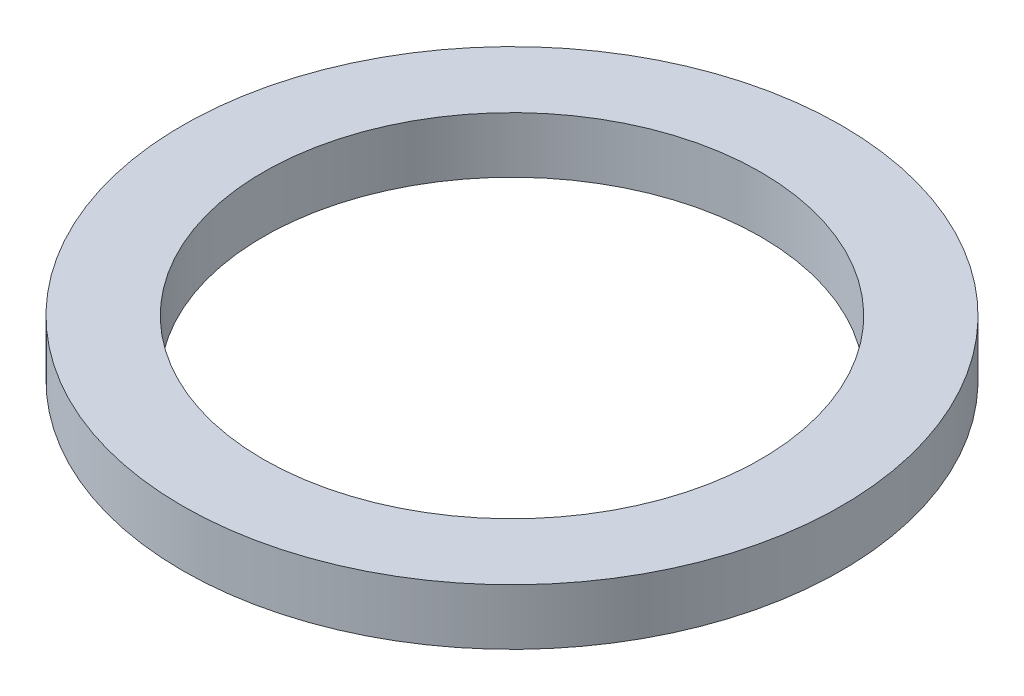
ISO-10303-21;
HEADER;
FILE_DESCRIPTION(('STEP AP214'),'2;1');
FILE_NAME('part.step','',(''),(''),'','','');
FILE_SCHEMA(('AUTOMOTIVE_DESIGN { 1 0 10303 214 1 1 1 1 }'));
ENDSEC;
DATA;
#1=APPLICATION_CONTEXT('core data for automotive mechanical design processes');
#2=APPLICATION_PROTOCOL_DEFINITION('international standard','automotive_design',2000,#1);
#3=PRODUCT_CONTEXT('',#1,'mechanical');
#4=PRODUCT('Part','Part','',(#3));
#5=PRODUCT_RELATED_PRODUCT_CATEGORY('part','',(#4));
#6=PRODUCT_DEFINITION_FORMATION('','',#4);
#7=PRODUCT_DEFINITION_CONTEXT('part definition',#1,'design');
#8=PRODUCT_DEFINITION('design','',#6,#7);
#9=PRODUCT_DEFINITION_SHAPE('','',#8);
#10=(LENGTH_UNIT() NAMED_UNIT(*) SI_UNIT(.MILLI.,.METRE.));
#11=(NAMED_UNIT(*) PLANE_ANGLE_UNIT() SI_UNIT($,.RADIAN.));
#12=(NAMED_UNIT(*) SI_UNIT($,.STERADIAN.) SOLID_ANGLE_UNIT());
#13=UNCERTAINTY_MEASURE_WITH_UNIT(LENGTH_MEASURE(1.E-05),#10,'distance_accuracy_value','');
#14=(GEOMETRIC_REPRESENTATION_CONTEXT(3) GLOBAL_UNCERTAINTY_ASSIGNED_CONTEXT((#13)) GLOBAL_UNIT_ASSIGNED_CONTEXT((#10,
#11,#12)) REPRESENTATION_CONTEXT('',''));
#15=CARTESIAN_POINT('',(0.,0.,0.));
#16=DIRECTION('',(0.,0.,1.));
#17=DIRECTION('',(1.,0.,0.));
#18=AXIS2_PLACEMENT_3D('',#15,#16,#17);
#19=CARTESIAN_POINT('',(0.,0.45,0.));
#20=DIRECTION('',(0.,1.,0.));
#21=DIRECTION('',(0.,0.,1.));
#22=AXIS2_PLACEMENT_3D('',#19,#20,#21);
#23=PLANE('',#22);
#24=CARTESIAN_POINT('',(0.,0.45,0.));
#25=DIRECTION('',(0.,1.,0.));
#26=DIRECTION('',(0.,0.,1.));
#27=AXIS2_PLACEMENT_3D('',#24,#25,#26);
#28=CIRCLE('',#27,5.3);
#29=CARTESIAN_POINT('',(0.,0.45,5.3));
#30=VERTEX_POINT('',#29);
#31=EDGE_CURVE('E10',#30,#30,#28,.T.);
#32=ORIENTED_EDGE('',*,*,#31,.T.);
#33=EDGE_LOOP('',(#32));
#34=FACE_BOUND('',#33,.T.);
#35=CARTESIAN_POINT('',(0.,0.45,0.));
#36=DIRECTION('',(0.,1.,0.));
#37=DIRECTION('',(0.,0.,1.));
#38=AXIS2_PLACEMENT_3D('',#35,#36,#37);
#39=CIRCLE('',#38,4.);
#40=CARTESIAN_POINT('',(0.,0.45,4.));
#41=VERTEX_POINT('',#40);
#42=EDGE_CURVE('E42',#41,#41,#39,.T.);
#43=ORIENTED_EDGE('',*,*,#42,.F.);
#44=EDGE_LOOP('',(#43));
#45=FACE_BOUND('',#44,.T.);
#46=ADVANCED_FACE('F31',(#34,#45),#23,.T.);
#47=CARTESIAN_POINT('',(0.,-0.45,0.));
#48=DIRECTION('',(0.,1.,0.));
#49=DIRECTION('',(0.,0.,1.));
#50=AXIS2_PLACEMENT_3D('',#47,#48,#49);
#51=PLANE('',#50);
#52=CARTESIAN_POINT('',(0.,-0.45,0.));
#53=DIRECTION('',(0.,1.,0.));
#54=DIRECTION('',(0.,0.,1.));
#55=AXIS2_PLACEMENT_3D('',#52,#53,#54);
#56=CIRCLE('',#55,5.3);
#57=CARTESIAN_POINT('',(0.,-0.45,5.3));
#58=VERTEX_POINT('',#57);
#59=EDGE_CURVE('E35',#58,#58,#56,.T.);
#60=ORIENTED_EDGE('',*,*,#59,.F.);
#61=EDGE_LOOP('',(#60));
#62=FACE_BOUND('',#61,.T.);
#63=CARTESIAN_POINT('',(0.,-0.45,0.));
#64=DIRECTION('',(0.,1.,0.));
#65=DIRECTION('',(0.,0.,1.));
#66=AXIS2_PLACEMENT_3D('',#63,#64,#65);
#67=CIRCLE('',#66,4.);
#68=CARTESIAN_POINT('',(0.,-0.45,4.));
#69=VERTEX_POINT('',#68);
#70=EDGE_CURVE('E44',#69,#69,#67,.T.);
#71=ORIENTED_EDGE('',*,*,#70,.T.);
#72=EDGE_LOOP('',(#71));
#73=FACE_BOUND('',#72,.T.);
#74=ADVANCED_FACE('F54',(#62,#73),#51,.F.);
#75=CARTESIAN_POINT('',(0.,0.45,0.));
#76=DIRECTION('',(0.,-1.,0.));
#77=DIRECTION('',(0.,0.,-1.));
#78=AXIS2_PLACEMENT_3D('',#75,#76,#77);
#79=CYLINDRICAL_SURFACE('',#78,5.3);
#80=ORIENTED_EDGE('',*,*,#31,.F.);
#81=EDGE_LOOP('',(#80));
#82=FACE_BOUND('',#81,.T.);
#83=ORIENTED_EDGE('',*,*,#59,.T.);
#84=EDGE_LOOP('',(#83));
#85=FACE_BOUND('',#84,.T.);
#86=ADVANCED_FACE('F33',(#82,#85),#79,.T.);
#87=CARTESIAN_POINT('',(0.,0.45,0.));
#88=DIRECTION('',(0.,-1.,0.));
#89=DIRECTION('',(0.,0.,-1.));
#90=AXIS2_PLACEMENT_3D('',#87,#88,#89);
#91=CYLINDRICAL_SURFACE('',#90,4.);
#92=ORIENTED_EDGE('',*,*,#42,.T.);
#93=EDGE_LOOP('',(#92));
#94=FACE_BOUND('',#93,.T.);
#95=ORIENTED_EDGE('',*,*,#70,.F.);
#96=EDGE_LOOP('',(#95));
#97=FACE_BOUND('',#96,.T.);
#98=ADVANCED_FACE('F50',(#94,#97),#91,.F.);
#99=CLOSED_SHELL('',(#46,#74,#86,#98));
#100=MANIFOLD_SOLID_BREP('B2',#99);
#101=ADVANCED_BREP_SHAPE_REPRESENTATION('',(#18,#100),#14);
#102=SHAPE_DEFINITION_REPRESENTATION(#9,#101);
ENDSEC;
END-ISO-10303-21;
